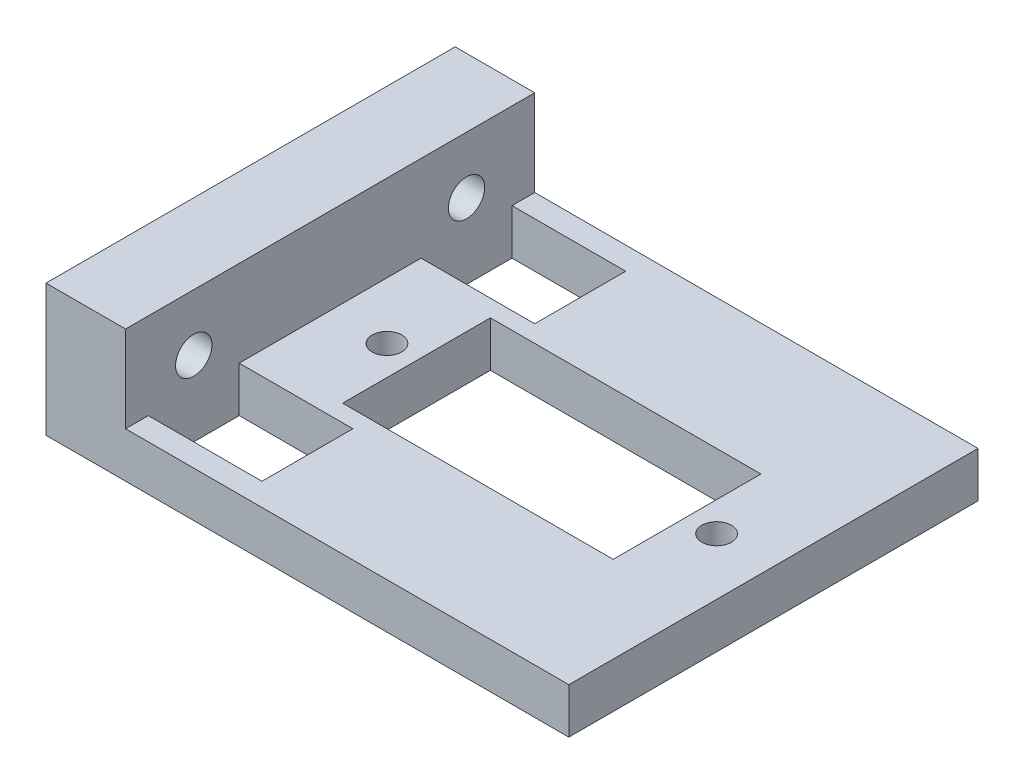
ISO-10303-21;
HEADER;
FILE_DESCRIPTION(('STEP AP214'),'2;1');
FILE_NAME('part.step','',(''),(''),'','','');
FILE_SCHEMA(('AUTOMOTIVE_DESIGN { 1 0 10303 214 1 1 1 1 }'));
ENDSEC;
DATA;
#1=APPLICATION_CONTEXT('core data for automotive mechanical design processes');
#2=APPLICATION_PROTOCOL_DEFINITION('international standard','automotive_design',2000,#1);
#3=PRODUCT_CONTEXT('',#1,'mechanical');
#4=PRODUCT('Part','Part','',(#3));
#5=PRODUCT_RELATED_PRODUCT_CATEGORY('part','',(#4));
#6=PRODUCT_DEFINITION_FORMATION('','',#4);
#7=PRODUCT_DEFINITION_CONTEXT('part definition',#1,'design');
#8=PRODUCT_DEFINITION('design','',#6,#7);
#9=PRODUCT_DEFINITION_SHAPE('','',#8);
#10=(LENGTH_UNIT() NAMED_UNIT(*) SI_UNIT(.MILLI.,.METRE.));
#11=(NAMED_UNIT(*) PLANE_ANGLE_UNIT() SI_UNIT($,.RADIAN.));
#12=(NAMED_UNIT(*) SI_UNIT($,.STERADIAN.) SOLID_ANGLE_UNIT());
#13=UNCERTAINTY_MEASURE_WITH_UNIT(LENGTH_MEASURE(1.E-05),#10,'distance_accuracy_value','');
#14=(GEOMETRIC_REPRESENTATION_CONTEXT(3) GLOBAL_UNCERTAINTY_ASSIGNED_CONTEXT((#13)) GLOBAL_UNIT_ASSIGNED_CONTEXT((#10,
#11,#12)) REPRESENTATION_CONTEXT('',''));
#15=CARTESIAN_POINT('',(0.,0.,0.));
#16=DIRECTION('',(0.,0.,1.));
#17=DIRECTION('',(1.,0.,0.));
#18=AXIS2_PLACEMENT_3D('',#15,#16,#17);
#19=CARTESIAN_POINT('',(0.,25.4,0.));
#20=DIRECTION('',(0.,-1.,0.));
#21=DIRECTION('',(0.,0.,-1.));
#22=AXIS2_PLACEMENT_3D('',#19,#20,#21);
#23=PLANE('',#22);
#24=CARTESIAN_POINT('',(-9.,25.4,0.));
#25=DIRECTION('',(0.,-1.,0.));
#26=DIRECTION('',(0.,0.,-1.));
#27=AXIS2_PLACEMENT_3D('',#24,#25,#26);
#28=CIRCLE('',#27,1.3);
#29=CARTESIAN_POINT('',(-9.,25.4,-1.3));
#30=VERTEX_POINT('',#29);
#31=EDGE_CURVE('E228',#30,#30,#28,.F.);
#32=ORIENTED_EDGE('',*,*,#31,.F.);
#33=EDGE_LOOP('',(#32));
#34=FACE_BOUND('',#33,.T.);
#35=CARTESIAN_POINT('',(20.,25.4,0.));
#36=DIRECTION('',(0.,-1.,0.));
#37=DIRECTION('',(0.,0.,-1.));
#38=AXIS2_PLACEMENT_3D('',#35,#36,#37);
#39=CIRCLE('',#38,1.3);
#40=CARTESIAN_POINT('',(20.,25.4,-1.3));
#41=VERTEX_POINT('',#40);
#42=EDGE_CURVE('E221',#41,#41,#39,.F.);
#43=ORIENTED_EDGE('',*,*,#42,.F.);
#44=EDGE_LOOP('',(#43));
#45=FACE_BOUND('',#44,.T.);
#46=DIRECTION('',(0.,0.,1.));
#47=VECTOR('',#46,1.);
#48=CARTESIAN_POINT('',(-6.4,25.4,0.));
#49=LINE('',#48,#47);
#50=CARTESIAN_POINT('',(-6.4,25.4,-6.5));
#51=VERTEX_POINT('',#50);
#52=CARTESIAN_POINT('',(-6.4,25.4,6.5));
#53=VERTEX_POINT('',#52);
#54=EDGE_CURVE('E327',#51,#53,#49,.T.);
#55=ORIENTED_EDGE('',*,*,#54,.F.);
#56=DIRECTION('',(-1.,0.,0.));
#57=VECTOR('',#56,1.);
#58=CARTESIAN_POINT('',(0.,25.4,-6.5));
#59=LINE('',#58,#57);
#60=CARTESIAN_POINT('',(17.4,25.4,-6.5));
#61=VERTEX_POINT('',#60);
#62=EDGE_CURVE('E318',#61,#51,#59,.T.);
#63=ORIENTED_EDGE('',*,*,#62,.F.);
#64=DIRECTION('',(0.,0.,-1.));
#65=VECTOR('',#64,1.);
#66=CARTESIAN_POINT('',(17.4,25.4,0.));
#67=LINE('',#66,#65);
#68=CARTESIAN_POINT('',(17.4,25.4,6.5));
#69=VERTEX_POINT('',#68);
#70=EDGE_CURVE('E321',#69,#61,#67,.T.);
#71=ORIENTED_EDGE('',*,*,#70,.F.);
#72=DIRECTION('',(1.,0.,0.));
#73=VECTOR('',#72,1.);
#74=CARTESIAN_POINT('',(0.,25.4,6.5));
#75=LINE('',#74,#73);
#76=EDGE_CURVE('E324',#53,#69,#75,.T.);
#77=ORIENTED_EDGE('',*,*,#76,.F.);
#78=EDGE_LOOP('',(#55,#63,#71,#77));
#79=FACE_BOUND('',#78,.T.);
#80=DIRECTION('',(1.,0.,0.));
#81=VECTOR('',#80,1.);
#82=CARTESIAN_POINT('',(0.,25.4,16.));
#83=LINE('',#82,#81);
#84=CARTESIAN_POINT('',(-14.,25.4,16.));
#85=VERTEX_POINT('',#84);
#86=CARTESIAN_POINT('',(-4.,25.4,16.));
#87=VERTEX_POINT('',#86);
#88=EDGE_CURVE('E258',#85,#87,#83,.T.);
#89=ORIENTED_EDGE('',*,*,#88,.F.);
#90=DIRECTION('',(0.,0.,-1.));
#91=VECTOR('',#90,1.);
#92=CARTESIAN_POINT('',(-14.,25.4,0.));
#93=LINE('',#92,#91);
#94=CARTESIAN_POINT('',(-14.,25.4,18.));
#95=VERTEX_POINT('',#94);
#96=EDGE_CURVE('E194',#95,#85,#93,.T.);
#97=ORIENTED_EDGE('',*,*,#96,.F.);
#98=DIRECTION('',(1.,0.,0.));
#99=VECTOR('',#98,1.);
#100=CARTESIAN_POINT('',(-21.,25.4,18.));
#101=LINE('',#100,#99);
#102=CARTESIAN_POINT('',(25.,25.4,18.));
#103=VERTEX_POINT('',#102);
#104=EDGE_CURVE('E355',#95,#103,#101,.T.);
#105=ORIENTED_EDGE('',*,*,#104,.T.);
#106=DIRECTION('',(0.,0.,-1.));
#107=VECTOR('',#106,1.);
#108=CARTESIAN_POINT('',(25.,25.4,18.));
#109=LINE('',#108,#107);
#110=CARTESIAN_POINT('',(25.,25.4,-18.));
#111=VERTEX_POINT('',#110);
#112=EDGE_CURVE('E356',#103,#111,#109,.T.);
#113=ORIENTED_EDGE('',*,*,#112,.T.);
#114=DIRECTION('',(-1.,0.,0.));
#115=VECTOR('',#114,1.);
#116=CARTESIAN_POINT('',(-21.,25.4,-18.));
#117=LINE('',#116,#115);
#118=CARTESIAN_POINT('',(-14.,25.4,-18.));
#119=VERTEX_POINT('',#118);
#120=EDGE_CURVE('E360',#111,#119,#117,.T.);
#121=ORIENTED_EDGE('',*,*,#120,.T.);
#122=CARTESIAN_POINT('',(-14.,25.4,-16.));
#123=VERTEX_POINT('',#122);
#124=EDGE_CURVE('E193',#123,#119,#93,.T.);
#125=ORIENTED_EDGE('',*,*,#124,.F.);
#126=DIRECTION('',(-1.,0.,0.));
#127=VECTOR('',#126,1.);
#128=CARTESIAN_POINT('',(0.,25.4,-16.));
#129=LINE('',#128,#127);
#130=CARTESIAN_POINT('',(-4.,25.4,-16.));
#131=VERTEX_POINT('',#130);
#132=EDGE_CURVE('E289',#131,#123,#129,.T.);
#133=ORIENTED_EDGE('',*,*,#132,.F.);
#134=DIRECTION('',(0.,0.,-1.));
#135=VECTOR('',#134,1.);
#136=CARTESIAN_POINT('',(-4.,25.4,0.));
#137=LINE('',#136,#135);
#138=CARTESIAN_POINT('',(-4.,25.4,-8.));
#139=VERTEX_POINT('',#138);
#140=EDGE_CURVE('E292',#139,#131,#137,.T.);
#141=ORIENTED_EDGE('',*,*,#140,.F.);
#142=DIRECTION('',(1.,0.,0.));
#143=VECTOR('',#142,1.);
#144=CARTESIAN_POINT('',(0.,25.4,-8.));
#145=LINE('',#144,#143);
#146=CARTESIAN_POINT('',(-14.,25.4,-8.));
#147=VERTEX_POINT('',#146);
#148=EDGE_CURVE('E191',#147,#139,#145,.T.);
#149=ORIENTED_EDGE('',*,*,#148,.F.);
#150=CARTESIAN_POINT('',(-14.,25.4,8.));
#151=VERTEX_POINT('',#150);
#152=EDGE_CURVE('E182',#151,#147,#93,.T.);
#153=ORIENTED_EDGE('',*,*,#152,.F.);
#154=DIRECTION('',(-1.,0.,0.));
#155=VECTOR('',#154,1.);
#156=CARTESIAN_POINT('',(0.,25.4,8.));
#157=LINE('',#156,#155);
#158=CARTESIAN_POINT('',(-4.,25.4,8.));
#159=VERTEX_POINT('',#158);
#160=EDGE_CURVE('E169',#159,#151,#157,.T.);
#161=ORIENTED_EDGE('',*,*,#160,.F.);
#162=DIRECTION('',(0.,0.,-1.));
#163=VECTOR('',#162,1.);
#164=CARTESIAN_POINT('',(-4.,25.4,0.));
#165=LINE('',#164,#163);
#166=EDGE_CURVE('E271',#87,#159,#165,.T.);
#167=ORIENTED_EDGE('',*,*,#166,.F.);
#168=EDGE_LOOP('',(#89,#97,#105,#113,#121,#125,#133,#141,#149,#153,#161,#167));
#169=FACE_BOUND('',#168,.T.);
#170=ADVANCED_FACE('F44',(#34,#45,#79,#169),#23,.F.);
#171=CARTESIAN_POINT('',(0.,21.4,0.));
#172=DIRECTION('',(0.,-1.,0.));
#173=DIRECTION('',(0.,0.,-1.));
#174=AXIS2_PLACEMENT_3D('',#171,#172,#173);
#175=PLANE('',#174);
#176=CARTESIAN_POINT('',(-9.,21.4,0.));
#177=DIRECTION('',(0.,-1.,0.));
#178=DIRECTION('',(0.,0.,-1.));
#179=AXIS2_PLACEMENT_3D('',#176,#177,#178);
#180=CIRCLE('',#179,1.3);
#181=CARTESIAN_POINT('',(-9.,21.4,-1.3));
#182=VERTEX_POINT('',#181);
#183=EDGE_CURVE('E223',#182,#182,#180,.F.);
#184=ORIENTED_EDGE('',*,*,#183,.T.);
#185=EDGE_LOOP('',(#184));
#186=FACE_BOUND('',#185,.T.);
#187=CARTESIAN_POINT('',(20.,21.4,0.));
#188=DIRECTION('',(0.,-1.,0.));
#189=DIRECTION('',(0.,0.,-1.));
#190=AXIS2_PLACEMENT_3D('',#187,#188,#189);
#191=CIRCLE('',#190,1.3);
#192=CARTESIAN_POINT('',(20.,21.4,-1.3));
#193=VERTEX_POINT('',#192);
#194=EDGE_CURVE('E219',#193,#193,#191,.F.);
#195=ORIENTED_EDGE('',*,*,#194,.T.);
#196=EDGE_LOOP('',(#195));
#197=FACE_BOUND('',#196,.T.);
#198=DIRECTION('',(0.,0.,1.));
#199=VECTOR('',#198,1.);
#200=CARTESIAN_POINT('',(-21.,21.4,18.));
#201=LINE('',#200,#199);
#202=CARTESIAN_POINT('',(-21.,21.4,-18.));
#203=VERTEX_POINT('',#202);
#204=CARTESIAN_POINT('',(-21.,21.4,18.));
#205=VERTEX_POINT('',#204);
#206=EDGE_CURVE('E351',#203,#205,#201,.T.);
#207=ORIENTED_EDGE('',*,*,#206,.F.);
#208=DIRECTION('',(-1.,0.,0.));
#209=VECTOR('',#208,1.);
#210=CARTESIAN_POINT('',(-21.,21.4,-18.));
#211=LINE('',#210,#209);
#212=CARTESIAN_POINT('',(25.,21.4,-18.));
#213=VERTEX_POINT('',#212);
#214=EDGE_CURVE('E357',#213,#203,#211,.T.);
#215=ORIENTED_EDGE('',*,*,#214,.F.);
#216=DIRECTION('',(0.,0.,-1.));
#217=VECTOR('',#216,1.);
#218=CARTESIAN_POINT('',(25.,21.4,18.));
#219=LINE('',#218,#217);
#220=CARTESIAN_POINT('',(25.,21.4,18.));
#221=VERTEX_POINT('',#220);
#222=EDGE_CURVE('E371',#221,#213,#219,.T.);
#223=ORIENTED_EDGE('',*,*,#222,.F.);
#224=DIRECTION('',(1.,0.,0.));
#225=VECTOR('',#224,1.);
#226=CARTESIAN_POINT('',(-21.,21.4,18.));
#227=LINE('',#226,#225);
#228=EDGE_CURVE('E366',#205,#221,#227,.T.);
#229=ORIENTED_EDGE('',*,*,#228,.F.);
#230=EDGE_LOOP('',(#207,#215,#223,#229));
#231=FACE_BOUND('',#230,.T.);
#232=DIRECTION('',(-1.,0.,0.));
#233=VECTOR('',#232,1.);
#234=CARTESIAN_POINT('',(0.,21.4,-6.5));
#235=LINE('',#234,#233);
#236=CARTESIAN_POINT('',(17.4,21.4,-6.5));
#237=VERTEX_POINT('',#236);
#238=CARTESIAN_POINT('',(-6.4,21.4,-6.5));
#239=VERTEX_POINT('',#238);
#240=EDGE_CURVE('E200',#237,#239,#235,.T.);
#241=ORIENTED_EDGE('',*,*,#240,.T.);
#242=DIRECTION('',(0.,0.,1.));
#243=VECTOR('',#242,1.);
#244=CARTESIAN_POINT('',(-6.4,21.4,0.));
#245=LINE('',#244,#243);
#246=CARTESIAN_POINT('',(-6.4,21.4,6.5));
#247=VERTEX_POINT('',#246);
#248=EDGE_CURVE('E214',#239,#247,#245,.T.);
#249=ORIENTED_EDGE('',*,*,#248,.T.);
#250=DIRECTION('',(1.,0.,0.));
#251=VECTOR('',#250,1.);
#252=CARTESIAN_POINT('',(0.,21.4,6.5));
#253=LINE('',#252,#251);
#254=CARTESIAN_POINT('',(17.4,21.4,6.5));
#255=VERTEX_POINT('',#254);
#256=EDGE_CURVE('E211',#247,#255,#253,.T.);
#257=ORIENTED_EDGE('',*,*,#256,.T.);
#258=DIRECTION('',(0.,0.,-1.));
#259=VECTOR('',#258,1.);
#260=CARTESIAN_POINT('',(17.4,21.4,0.));
#261=LINE('',#260,#259);
#262=EDGE_CURVE('E210',#255,#237,#261,.T.);
#263=ORIENTED_EDGE('',*,*,#262,.T.);
#264=EDGE_LOOP('',(#241,#249,#257,#263));
#265=FACE_BOUND('',#264,.T.);
#266=DIRECTION('',(-1.,0.,0.));
#267=VECTOR('',#266,1.);
#268=CARTESIAN_POINT('',(0.,21.4,-16.));
#269=LINE('',#268,#267);
#270=CARTESIAN_POINT('',(-4.,21.4,-16.));
#271=VERTEX_POINT('',#270);
#272=CARTESIAN_POINT('',(-14.,21.4,-16.));
#273=VERTEX_POINT('',#272);
#274=EDGE_CURVE('E218',#271,#273,#269,.T.);
#275=ORIENTED_EDGE('',*,*,#274,.T.);
#276=DIRECTION('',(0.,0.,1.));
#277=VECTOR('',#276,1.);
#278=CARTESIAN_POINT('',(-14.,21.4,0.));
#279=LINE('',#278,#277);
#280=CARTESIAN_POINT('',(-14.,21.4,-8.));
#281=VERTEX_POINT('',#280);
#282=EDGE_CURVE('E244',#273,#281,#279,.T.);
#283=ORIENTED_EDGE('',*,*,#282,.T.);
#284=DIRECTION('',(1.,0.,0.));
#285=VECTOR('',#284,1.);
#286=CARTESIAN_POINT('',(0.,21.4,-8.));
#287=LINE('',#286,#285);
#288=CARTESIAN_POINT('',(-4.,21.4,-8.));
#289=VERTEX_POINT('',#288);
#290=EDGE_CURVE('E240',#281,#289,#287,.T.);
#291=ORIENTED_EDGE('',*,*,#290,.T.);
#292=DIRECTION('',(0.,0.,-1.));
#293=VECTOR('',#292,1.);
#294=CARTESIAN_POINT('',(-4.,21.4,0.));
#295=LINE('',#294,#293);
#296=EDGE_CURVE('E234',#289,#271,#295,.T.);
#297=ORIENTED_EDGE('',*,*,#296,.T.);
#298=EDGE_LOOP('',(#275,#283,#291,#297));
#299=FACE_BOUND('',#298,.T.);
#300=DIRECTION('',(-1.,0.,0.));
#301=VECTOR('',#300,1.);
#302=CARTESIAN_POINT('',(0.,21.4,8.));
#303=LINE('',#302,#301);
#304=CARTESIAN_POINT('',(-4.,21.4,8.));
#305=VERTEX_POINT('',#304);
#306=CARTESIAN_POINT('',(-14.,21.4,8.));
#307=VERTEX_POINT('',#306);
#308=EDGE_CURVE('E172',#305,#307,#303,.T.);
#309=ORIENTED_EDGE('',*,*,#308,.T.);
#310=DIRECTION('',(0.,0.,1.));
#311=VECTOR('',#310,1.);
#312=CARTESIAN_POINT('',(-14.,21.4,0.));
#313=LINE('',#312,#311);
#314=CARTESIAN_POINT('',(-14.,21.4,16.));
#315=VERTEX_POINT('',#314);
#316=EDGE_CURVE('E11',#307,#315,#313,.T.);
#317=ORIENTED_EDGE('',*,*,#316,.T.);
#318=DIRECTION('',(1.,0.,0.));
#319=VECTOR('',#318,1.);
#320=CARTESIAN_POINT('',(0.,21.4,16.));
#321=LINE('',#320,#319);
#322=CARTESIAN_POINT('',(-4.,21.4,16.));
#323=VERTEX_POINT('',#322);
#324=EDGE_CURVE('E173',#315,#323,#321,.T.);
#325=ORIENTED_EDGE('',*,*,#324,.T.);
#326=DIRECTION('',(0.,0.,-1.));
#327=VECTOR('',#326,1.);
#328=CARTESIAN_POINT('',(-4.,21.4,0.));
#329=LINE('',#328,#327);
#330=EDGE_CURVE('E53',#323,#305,#329,.T.);
#331=ORIENTED_EDGE('',*,*,#330,.T.);
#332=EDGE_LOOP('',(#309,#317,#325,#331));
#333=FACE_BOUND('',#332,.T.);
#334=ADVANCED_FACE('F249',(#186,#197,#231,#265,#299,#333),#175,.T.);
#335=CARTESIAN_POINT('',(-21.,25.4,18.));
#336=DIRECTION('',(1.,0.,0.));
#337=DIRECTION('',(0.,0.,-1.));
#338=AXIS2_PLACEMENT_3D('',#335,#336,#337);
#339=PLANE('',#338);
#340=CARTESIAN_POINT('',(-21.,28.,-12.));
#341=DIRECTION('',(1.,0.,0.));
#342=DIRECTION('',(0.,0.,-1.));
#343=AXIS2_PLACEMENT_3D('',#340,#341,#342);
#344=CIRCLE('',#343,1.6);
#345=CARTESIAN_POINT('',(-21.,28.,-13.6));
#346=VERTEX_POINT('',#345);
#347=EDGE_CURVE('E189',#346,#346,#344,.F.);
#348=ORIENTED_EDGE('',*,*,#347,.F.);
#349=EDGE_LOOP('',(#348));
#350=FACE_BOUND('',#349,.T.);
#351=CARTESIAN_POINT('',(-21.,28.,12.));
#352=DIRECTION('',(1.,0.,0.));
#353=DIRECTION('',(0.,0.,-1.));
#354=AXIS2_PLACEMENT_3D('',#351,#352,#353);
#355=CIRCLE('',#354,1.6);
#356=CARTESIAN_POINT('',(-21.,28.,10.4));
#357=VERTEX_POINT('',#356);
#358=EDGE_CURVE('E453',#357,#357,#355,.F.);
#359=ORIENTED_EDGE('',*,*,#358,.F.);
#360=EDGE_LOOP('',(#359));
#361=FACE_BOUND('',#360,.T.);
#362=ORIENTED_EDGE('',*,*,#206,.T.);
#363=DIRECTION('',(0.,-1.,0.));
#364=VECTOR('',#363,1.);
#365=CARTESIAN_POINT('',(-21.,25.4,18.));
#366=LINE('',#365,#364);
#367=CARTESIAN_POINT('',(-21.,33.,18.));
#368=VERTEX_POINT('',#367);
#369=EDGE_CURVE('E199',#368,#205,#366,.T.);
#370=ORIENTED_EDGE('',*,*,#369,.F.);
#371=DIRECTION('',(0.,0.,-1.));
#372=VECTOR('',#371,1.);
#373=CARTESIAN_POINT('',(-21.,33.,18.));
#374=LINE('',#373,#372);
#375=CARTESIAN_POINT('',(-21.,33.,-18.));
#376=VERTEX_POINT('',#375);
#377=EDGE_CURVE('E337',#368,#376,#374,.T.);
#378=ORIENTED_EDGE('',*,*,#377,.T.);
#379=DIRECTION('',(0.,-1.,0.));
#380=VECTOR('',#379,1.);
#381=CARTESIAN_POINT('',(-21.,25.4,-18.));
#382=LINE('',#381,#380);
#383=EDGE_CURVE('E365',#376,#203,#382,.T.);
#384=ORIENTED_EDGE('',*,*,#383,.T.);
#385=EDGE_LOOP('',(#362,#370,#378,#384));
#386=FACE_BOUND('',#385,.T.);
#387=ADVANCED_FACE('F50',(#350,#361,#386),#339,.F.);
#388=CARTESIAN_POINT('',(-21.,25.4,18.));
#389=DIRECTION('',(0.,0.,-1.));
#390=DIRECTION('',(-1.,0.,0.));
#391=AXIS2_PLACEMENT_3D('',#388,#389,#390);
#392=PLANE('',#391);
#393=ORIENTED_EDGE('',*,*,#369,.T.);
#394=ORIENTED_EDGE('',*,*,#228,.T.);
#395=DIRECTION('',(0.,-1.,0.));
#396=VECTOR('',#395,1.);
#397=CARTESIAN_POINT('',(25.,25.4,18.));
#398=LINE('',#397,#396);
#399=EDGE_CURVE('E385',#103,#221,#398,.T.);
#400=ORIENTED_EDGE('',*,*,#399,.F.);
#401=ORIENTED_EDGE('',*,*,#104,.F.);
#402=DIRECTION('',(0.,1.,0.));
#403=VECTOR('',#402,1.);
#404=CARTESIAN_POINT('',(-14.,23.,18.));
#405=LINE('',#404,#403);
#406=CARTESIAN_POINT('',(-14.,33.,18.));
#407=VERTEX_POINT('',#406);
#408=EDGE_CURVE('E335',#95,#407,#405,.T.);
#409=ORIENTED_EDGE('',*,*,#408,.T.);
#410=DIRECTION('',(-1.,0.,0.));
#411=VECTOR('',#410,1.);
#412=CARTESIAN_POINT('',(-21.,33.,18.));
#413=LINE('',#412,#411);
#414=EDGE_CURVE('E333',#407,#368,#413,.T.);
#415=ORIENTED_EDGE('',*,*,#414,.T.);
#416=EDGE_LOOP('',(#393,#394,#400,#401,#409,#415));
#417=FACE_BOUND('',#416,.T.);
#418=ADVANCED_FACE('F391',(#417),#392,.F.);
#419=CARTESIAN_POINT('',(25.,25.4,18.));
#420=DIRECTION('',(-1.,0.,0.));
#421=DIRECTION('',(0.,0.,1.));
#422=AXIS2_PLACEMENT_3D('',#419,#420,#421);
#423=PLANE('',#422);
#424=ORIENTED_EDGE('',*,*,#222,.T.);
#425=DIRECTION('',(0.,-1.,0.));
#426=VECTOR('',#425,1.);
#427=CARTESIAN_POINT('',(25.,25.4,-18.));
#428=LINE('',#427,#426);
#429=EDGE_CURVE('E377',#111,#213,#428,.T.);
#430=ORIENTED_EDGE('',*,*,#429,.F.);
#431=ORIENTED_EDGE('',*,*,#112,.F.);
#432=ORIENTED_EDGE('',*,*,#399,.T.);
#433=EDGE_LOOP('',(#424,#430,#431,#432));
#434=FACE_BOUND('',#433,.T.);
#435=ADVANCED_FACE('F409',(#434),#423,.F.);
#436=CARTESIAN_POINT('',(-21.,25.4,-18.));
#437=DIRECTION('',(0.,0.,1.));
#438=DIRECTION('',(1.,0.,0.));
#439=AXIS2_PLACEMENT_3D('',#436,#437,#438);
#440=PLANE('',#439);
#441=ORIENTED_EDGE('',*,*,#383,.F.);
#442=DIRECTION('',(-1.,0.,0.));
#443=VECTOR('',#442,1.);
#444=CARTESIAN_POINT('',(-21.,33.,-18.));
#445=LINE('',#444,#443);
#446=CARTESIAN_POINT('',(-14.,33.,-18.));
#447=VERTEX_POINT('',#446);
#448=EDGE_CURVE('E339',#447,#376,#445,.T.);
#449=ORIENTED_EDGE('',*,*,#448,.F.);
#450=DIRECTION('',(0.,1.,0.));
#451=VECTOR('',#450,1.);
#452=CARTESIAN_POINT('',(-14.,23.,-18.));
#453=LINE('',#452,#451);
#454=EDGE_CURVE('E332',#119,#447,#453,.T.);
#455=ORIENTED_EDGE('',*,*,#454,.F.);
#456=ORIENTED_EDGE('',*,*,#120,.F.);
#457=ORIENTED_EDGE('',*,*,#429,.T.);
#458=ORIENTED_EDGE('',*,*,#214,.T.);
#459=EDGE_LOOP('',(#441,#449,#455,#456,#457,#458));
#460=FACE_BOUND('',#459,.T.);
#461=ADVANCED_FACE('F405',(#460),#440,.F.);
#462=CARTESIAN_POINT('',(-14.,23.,18.));
#463=DIRECTION('',(-1.,0.,0.));
#464=DIRECTION('',(0.,0.,1.));
#465=AXIS2_PLACEMENT_3D('',#462,#463,#464);
#466=PLANE('',#465);
#467=CARTESIAN_POINT('',(-14.,28.,-12.));
#468=DIRECTION('',(1.,0.,0.));
#469=DIRECTION('',(0.,0.,-1.));
#470=AXIS2_PLACEMENT_3D('',#467,#468,#469);
#471=CIRCLE('',#470,1.6);
#472=CARTESIAN_POINT('',(-14.,28.,-13.6));
#473=VERTEX_POINT('',#472);
#474=EDGE_CURVE('E460',#473,#473,#471,.T.);
#475=ORIENTED_EDGE('',*,*,#474,.F.);
#476=EDGE_LOOP('',(#475));
#477=FACE_BOUND('',#476,.T.);
#478=CARTESIAN_POINT('',(-14.,28.,12.));
#479=DIRECTION('',(1.,0.,0.));
#480=DIRECTION('',(0.,0.,-1.));
#481=AXIS2_PLACEMENT_3D('',#478,#479,#480);
#482=CIRCLE('',#481,1.6);
#483=CARTESIAN_POINT('',(-14.,28.,10.4));
#484=VERTEX_POINT('',#483);
#485=EDGE_CURVE('E465',#484,#484,#482,.T.);
#486=ORIENTED_EDGE('',*,*,#485,.F.);
#487=EDGE_LOOP('',(#486));
#488=FACE_BOUND('',#487,.T.);
#489=ORIENTED_EDGE('',*,*,#454,.T.);
#490=DIRECTION('',(0.,0.,-1.));
#491=VECTOR('',#490,1.);
#492=CARTESIAN_POINT('',(-14.,33.,18.));
#493=LINE('',#492,#491);
#494=EDGE_CURVE('E349',#407,#447,#493,.T.);
#495=ORIENTED_EDGE('',*,*,#494,.F.);
#496=ORIENTED_EDGE('',*,*,#408,.F.);
#497=ORIENTED_EDGE('',*,*,#96,.T.);
#498=DIRECTION('',(0.,-1.,0.));
#499=VECTOR('',#498,1.);
#500=CARTESIAN_POINT('',(-14.,33.,16.));
#501=LINE('',#500,#499);
#502=EDGE_CURVE('E256',#85,#315,#501,.T.);
#503=ORIENTED_EDGE('',*,*,#502,.T.);
#504=ORIENTED_EDGE('',*,*,#316,.F.);
#505=DIRECTION('',(0.,-1.,0.));
#506=VECTOR('',#505,1.);
#507=CARTESIAN_POINT('',(-14.,33.,8.));
#508=LINE('',#507,#506);
#509=EDGE_CURVE('E66',#151,#307,#508,.T.);
#510=ORIENTED_EDGE('',*,*,#509,.F.);
#511=ORIENTED_EDGE('',*,*,#152,.T.);
#512=DIRECTION('',(0.,-1.,0.));
#513=VECTOR('',#512,1.);
#514=CARTESIAN_POINT('',(-14.,33.,-8.));
#515=LINE('',#514,#513);
#516=EDGE_CURVE('E282',#147,#281,#515,.T.);
#517=ORIENTED_EDGE('',*,*,#516,.T.);
#518=ORIENTED_EDGE('',*,*,#282,.F.);
#519=DIRECTION('',(0.,-1.,0.));
#520=VECTOR('',#519,1.);
#521=CARTESIAN_POINT('',(-14.,33.,-16.));
#522=LINE('',#521,#520);
#523=EDGE_CURVE('E273',#123,#273,#522,.T.);
#524=ORIENTED_EDGE('',*,*,#523,.F.);
#525=ORIENTED_EDGE('',*,*,#124,.T.);
#526=EDGE_LOOP('',(#489,#495,#496,#497,#503,#504,#510,#511,#517,#518,#524,#525));
#527=FACE_BOUND('',#526,.T.);
#528=ADVANCED_FACE('F178',(#477,#488,#527),#466,.F.);
#529=CARTESIAN_POINT('',(-21.,33.,18.));
#530=DIRECTION('',(0.,-1.,0.));
#531=DIRECTION('',(0.,0.,-1.));
#532=AXIS2_PLACEMENT_3D('',#529,#530,#531);
#533=PLANE('',#532);
#534=ORIENTED_EDGE('',*,*,#448,.T.);
#535=ORIENTED_EDGE('',*,*,#377,.F.);
#536=ORIENTED_EDGE('',*,*,#414,.F.);
#537=ORIENTED_EDGE('',*,*,#494,.T.);
#538=EDGE_LOOP('',(#534,#535,#536,#537));
#539=FACE_BOUND('',#538,.T.);
#540=ADVANCED_FACE('F412',(#539),#533,.F.);
#541=CARTESIAN_POINT('',(-6.4,33.,6.5));
#542=DIRECTION('',(1.,0.,0.));
#543=DIRECTION('',(0.,0.,-1.));
#544=AXIS2_PLACEMENT_3D('',#541,#542,#543);
#545=PLANE('',#544);
#546=ORIENTED_EDGE('',*,*,#54,.T.);
#547=DIRECTION('',(0.,-1.,0.));
#548=VECTOR('',#547,1.);
#549=CARTESIAN_POINT('',(-6.4,33.,6.5));
#550=LINE('',#549,#548);
#551=EDGE_CURVE('E314',#53,#247,#550,.T.);
#552=ORIENTED_EDGE('',*,*,#551,.T.);
#553=ORIENTED_EDGE('',*,*,#248,.F.);
#554=DIRECTION('',(0.,-1.,0.));
#555=VECTOR('',#554,1.);
#556=CARTESIAN_POINT('',(-6.4,33.,-6.5));
#557=LINE('',#556,#555);
#558=EDGE_CURVE('E304',#51,#239,#557,.T.);
#559=ORIENTED_EDGE('',*,*,#558,.F.);
#560=EDGE_LOOP('',(#546,#552,#553,#559));
#561=FACE_BOUND('',#560,.T.);
#562=ADVANCED_FACE('F413',(#561),#545,.T.);
#563=CARTESIAN_POINT('',(-6.4,33.,6.5));
#564=DIRECTION('',(0.,0.,-1.));
#565=DIRECTION('',(-1.,0.,0.));
#566=AXIS2_PLACEMENT_3D('',#563,#564,#565);
#567=PLANE('',#566);
#568=ORIENTED_EDGE('',*,*,#76,.T.);
#569=DIRECTION('',(0.,-1.,0.));
#570=VECTOR('',#569,1.);
#571=CARTESIAN_POINT('',(17.4,33.,6.5));
#572=LINE('',#571,#570);
#573=EDGE_CURVE('E309',#69,#255,#572,.T.);
#574=ORIENTED_EDGE('',*,*,#573,.T.);
#575=ORIENTED_EDGE('',*,*,#256,.F.);
#576=ORIENTED_EDGE('',*,*,#551,.F.);
#577=EDGE_LOOP('',(#568,#574,#575,#576));
#578=FACE_BOUND('',#577,.T.);
#579=ADVANCED_FACE('F423',(#578),#567,.T.);
#580=CARTESIAN_POINT('',(17.4,33.,6.5));
#581=DIRECTION('',(-1.,0.,0.));
#582=DIRECTION('',(0.,0.,1.));
#583=AXIS2_PLACEMENT_3D('',#580,#581,#582);
#584=PLANE('',#583);
#585=ORIENTED_EDGE('',*,*,#70,.T.);
#586=DIRECTION('',(0.,-1.,0.));
#587=VECTOR('',#586,1.);
#588=CARTESIAN_POINT('',(17.4,33.,-6.5));
#589=LINE('',#588,#587);
#590=EDGE_CURVE('E308',#61,#237,#589,.T.);
#591=ORIENTED_EDGE('',*,*,#590,.T.);
#592=ORIENTED_EDGE('',*,*,#262,.F.);
#593=ORIENTED_EDGE('',*,*,#573,.F.);
#594=EDGE_LOOP('',(#585,#591,#592,#593));
#595=FACE_BOUND('',#594,.T.);
#596=ADVANCED_FACE('F507',(#595),#584,.T.);
#597=CARTESIAN_POINT('',(-6.4,33.,-6.5));
#598=DIRECTION('',(0.,0.,1.));
#599=DIRECTION('',(1.,0.,0.));
#600=AXIS2_PLACEMENT_3D('',#597,#598,#599);
#601=PLANE('',#600);
#602=ORIENTED_EDGE('',*,*,#62,.T.);
#603=ORIENTED_EDGE('',*,*,#558,.T.);
#604=ORIENTED_EDGE('',*,*,#240,.F.);
#605=ORIENTED_EDGE('',*,*,#590,.F.);
#606=EDGE_LOOP('',(#602,#603,#604,#605));
#607=FACE_BOUND('',#606,.T.);
#608=ADVANCED_FACE('F505',(#607),#601,.T.);
#609=CARTESIAN_POINT('',(20.,33.,0.));
#610=DIRECTION('',(0.,-1.,0.));
#611=DIRECTION('',(0.,0.,-1.));
#612=AXIS2_PLACEMENT_3D('',#609,#610,#611);
#613=CYLINDRICAL_SURFACE('',#612,1.3);
#614=ORIENTED_EDGE('',*,*,#194,.F.);
#615=EDGE_LOOP('',(#614));
#616=FACE_BOUND('',#615,.T.);
#617=ORIENTED_EDGE('',*,*,#42,.T.);
#618=EDGE_LOOP('',(#617));
#619=FACE_BOUND('',#618,.T.);
#620=ADVANCED_FACE('F496',(#616,#619),#613,.F.);
#621=CARTESIAN_POINT('',(-9.,33.,0.));
#622=DIRECTION('',(0.,-1.,0.));
#623=DIRECTION('',(0.,0.,-1.));
#624=AXIS2_PLACEMENT_3D('',#621,#622,#623);
#625=CYLINDRICAL_SURFACE('',#624,1.3);
#626=ORIENTED_EDGE('',*,*,#183,.F.);
#627=EDGE_LOOP('',(#626));
#628=FACE_BOUND('',#627,.T.);
#629=ORIENTED_EDGE('',*,*,#31,.T.);
#630=EDGE_LOOP('',(#629));
#631=FACE_BOUND('',#630,.T.);
#632=ADVANCED_FACE('F494',(#628,#631),#625,.F.);
#633=CARTESIAN_POINT('',(-14.,33.,-8.));
#634=DIRECTION('',(0.,0.,-1.));
#635=DIRECTION('',(-1.,0.,0.));
#636=AXIS2_PLACEMENT_3D('',#633,#634,#635);
#637=PLANE('',#636);
#638=ORIENTED_EDGE('',*,*,#148,.T.);
#639=DIRECTION('',(0.,-1.,0.));
#640=VECTOR('',#639,1.);
#641=CARTESIAN_POINT('',(-4.,33.,-8.));
#642=LINE('',#641,#640);
#643=EDGE_CURVE('E284',#139,#289,#642,.T.);
#644=ORIENTED_EDGE('',*,*,#643,.T.);
#645=ORIENTED_EDGE('',*,*,#290,.F.);
#646=ORIENTED_EDGE('',*,*,#516,.F.);
#647=EDGE_LOOP('',(#638,#644,#645,#646));
#648=FACE_BOUND('',#647,.T.);
#649=ADVANCED_FACE('F491',(#648),#637,.T.);
#650=CARTESIAN_POINT('',(-4.,33.,-8.));
#651=DIRECTION('',(-1.,0.,0.));
#652=DIRECTION('',(0.,0.,1.));
#653=AXIS2_PLACEMENT_3D('',#650,#651,#652);
#654=PLANE('',#653);
#655=ORIENTED_EDGE('',*,*,#140,.T.);
#656=DIRECTION('',(0.,-1.,0.));
#657=VECTOR('',#656,1.);
#658=CARTESIAN_POINT('',(-4.,33.,-16.));
#659=LINE('',#658,#657);
#660=EDGE_CURVE('E280',#131,#271,#659,.T.);
#661=ORIENTED_EDGE('',*,*,#660,.T.);
#662=ORIENTED_EDGE('',*,*,#296,.F.);
#663=ORIENTED_EDGE('',*,*,#643,.F.);
#664=EDGE_LOOP('',(#655,#661,#662,#663));
#665=FACE_BOUND('',#664,.T.);
#666=ADVANCED_FACE('F490',(#665),#654,.T.);
#667=CARTESIAN_POINT('',(-14.,33.,-16.));
#668=DIRECTION('',(0.,0.,1.));
#669=DIRECTION('',(1.,0.,0.));
#670=AXIS2_PLACEMENT_3D('',#667,#668,#669);
#671=PLANE('',#670);
#672=ORIENTED_EDGE('',*,*,#132,.T.);
#673=ORIENTED_EDGE('',*,*,#523,.T.);
#674=ORIENTED_EDGE('',*,*,#274,.F.);
#675=ORIENTED_EDGE('',*,*,#660,.F.);
#676=EDGE_LOOP('',(#672,#673,#674,#675));
#677=FACE_BOUND('',#676,.T.);
#678=ADVANCED_FACE('F483',(#677),#671,.T.);
#679=CARTESIAN_POINT('',(-4.,33.,16.));
#680=DIRECTION('',(-1.,0.,0.));
#681=DIRECTION('',(0.,0.,1.));
#682=AXIS2_PLACEMENT_3D('',#679,#680,#681);
#683=PLANE('',#682);
#684=ORIENTED_EDGE('',*,*,#166,.T.);
#685=DIRECTION('',(0.,-1.,0.));
#686=VECTOR('',#685,1.);
#687=CARTESIAN_POINT('',(-4.,33.,8.));
#688=LINE('',#687,#686);
#689=EDGE_CURVE('E64',#159,#305,#688,.T.);
#690=ORIENTED_EDGE('',*,*,#689,.T.);
#691=ORIENTED_EDGE('',*,*,#330,.F.);
#692=DIRECTION('',(0.,-1.,0.));
#693=VECTOR('',#692,1.);
#694=CARTESIAN_POINT('',(-4.,33.,16.));
#695=LINE('',#694,#693);
#696=EDGE_CURVE('E251',#87,#323,#695,.T.);
#697=ORIENTED_EDGE('',*,*,#696,.F.);
#698=EDGE_LOOP('',(#684,#690,#691,#697));
#699=FACE_BOUND('',#698,.T.);
#700=ADVANCED_FACE('F252',(#699),#683,.T.);
#701=CARTESIAN_POINT('',(-14.,33.,16.));
#702=DIRECTION('',(0.,0.,-1.));
#703=DIRECTION('',(-1.,0.,0.));
#704=AXIS2_PLACEMENT_3D('',#701,#702,#703);
#705=PLANE('',#704);
#706=ORIENTED_EDGE('',*,*,#88,.T.);
#707=ORIENTED_EDGE('',*,*,#696,.T.);
#708=ORIENTED_EDGE('',*,*,#324,.F.);
#709=ORIENTED_EDGE('',*,*,#502,.F.);
#710=EDGE_LOOP('',(#706,#707,#708,#709));
#711=FACE_BOUND('',#710,.T.);
#712=ADVANCED_FACE('F254',(#711),#705,.T.);
#713=CARTESIAN_POINT('',(-14.,33.,8.));
#714=DIRECTION('',(0.,0.,1.));
#715=DIRECTION('',(1.,0.,0.));
#716=AXIS2_PLACEMENT_3D('',#713,#714,#715);
#717=PLANE('',#716);
#718=ORIENTED_EDGE('',*,*,#160,.T.);
#719=ORIENTED_EDGE('',*,*,#509,.T.);
#720=ORIENTED_EDGE('',*,*,#308,.F.);
#721=ORIENTED_EDGE('',*,*,#689,.F.);
#722=EDGE_LOOP('',(#718,#719,#720,#721));
#723=FACE_BOUND('',#722,.T.);
#724=ADVANCED_FACE('F166',(#723),#717,.T.);
#725=CARTESIAN_POINT('',(-14.,28.,12.));
#726=DIRECTION('',(-1.,0.,0.));
#727=DIRECTION('',(0.,0.,1.));
#728=AXIS2_PLACEMENT_3D('',#725,#726,#727);
#729=CYLINDRICAL_SURFACE('',#728,1.6);
#730=ORIENTED_EDGE('',*,*,#485,.T.);
#731=EDGE_LOOP('',(#730));
#732=FACE_BOUND('',#731,.T.);
#733=ORIENTED_EDGE('',*,*,#358,.T.);
#734=EDGE_LOOP('',(#733));
#735=FACE_BOUND('',#734,.T.);
#736=ADVANCED_FACE('F470',(#732,#735),#729,.F.);
#737=CARTESIAN_POINT('',(-14.,28.,-12.));
#738=DIRECTION('',(-1.,0.,0.));
#739=DIRECTION('',(0.,0.,1.));
#740=AXIS2_PLACEMENT_3D('',#737,#738,#739);
#741=CYLINDRICAL_SURFACE('',#740,1.6);
#742=ORIENTED_EDGE('',*,*,#474,.T.);
#743=EDGE_LOOP('',(#742));
#744=FACE_BOUND('',#743,.T.);
#745=ORIENTED_EDGE('',*,*,#347,.T.);
#746=EDGE_LOOP('',(#745));
#747=FACE_BOUND('',#746,.T.);
#748=ADVANCED_FACE('F471',(#744,#747),#741,.F.);
#749=CLOSED_SHELL('',(#170,#334,#387,#418,#435,#461,#528,#540,#562,#579,#596,#608,#620,#632,
#649,#666,#678,#700,#712,#724,#736,#748));
#750=MANIFOLD_SOLID_BREP('B2',#749);
#751=ADVANCED_BREP_SHAPE_REPRESENTATION('',(#18,#750),#14);
#752=SHAPE_DEFINITION_REPRESENTATION(#9,#751);
ENDSEC;
END-ISO-10303-21;
